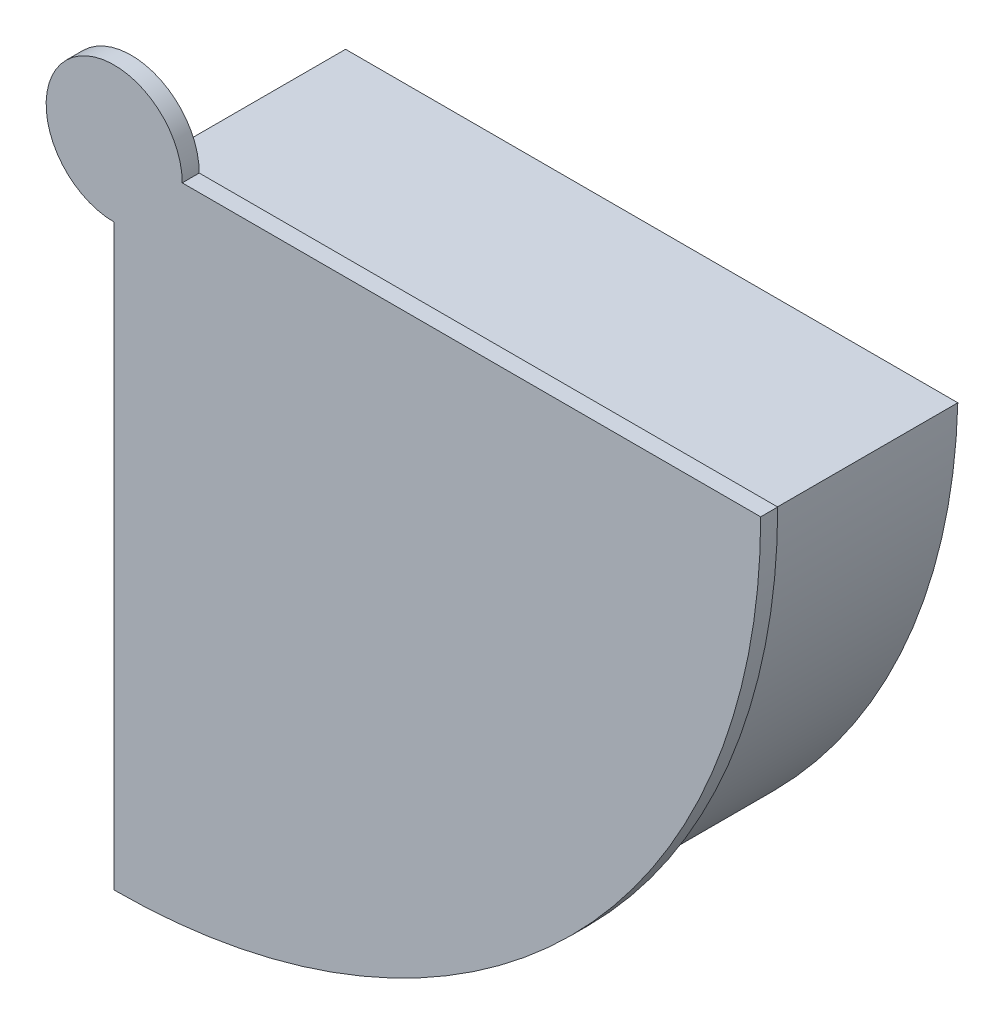
ISO-10303-21;
HEADER;
FILE_DESCRIPTION(('STEP AP214'),'2;1');
FILE_NAME('part.step','',(''),(''),'','','');
FILE_SCHEMA(('AUTOMOTIVE_DESIGN { 1 0 10303 214 1 1 1 1 }'));
ENDSEC;
DATA;
#1=APPLICATION_CONTEXT('core data for automotive mechanical design processes');
#2=APPLICATION_PROTOCOL_DEFINITION('international standard','automotive_design',2000,#1);
#3=PRODUCT_CONTEXT('',#1,'mechanical');
#4=PRODUCT('Part','Part','',(#3));
#5=PRODUCT_RELATED_PRODUCT_CATEGORY('part','',(#4));
#6=PRODUCT_DEFINITION_FORMATION('','',#4);
#7=PRODUCT_DEFINITION_CONTEXT('part definition',#1,'design');
#8=PRODUCT_DEFINITION('design','',#6,#7);
#9=PRODUCT_DEFINITION_SHAPE('','',#8);
#10=(LENGTH_UNIT() NAMED_UNIT(*) SI_UNIT(.MILLI.,.METRE.));
#11=(NAMED_UNIT(*) PLANE_ANGLE_UNIT() SI_UNIT($,.RADIAN.));
#12=(NAMED_UNIT(*) SI_UNIT($,.STERADIAN.) SOLID_ANGLE_UNIT());
#13=UNCERTAINTY_MEASURE_WITH_UNIT(LENGTH_MEASURE(1.E-05),#10,'distance_accuracy_value','');
#14=(GEOMETRIC_REPRESENTATION_CONTEXT(3) GLOBAL_UNCERTAINTY_ASSIGNED_CONTEXT((#13)) GLOBAL_UNIT_ASSIGNED_CONTEXT((#10,
#11,#12)) REPRESENTATION_CONTEXT('',''));
#15=CARTESIAN_POINT('',(0.,0.,0.));
#16=DIRECTION('',(0.,0.,1.));
#17=DIRECTION('',(1.,0.,0.));
#18=AXIS2_PLACEMENT_3D('',#15,#16,#17);
#19=CARTESIAN_POINT('',(0.,0.,0.));
#20=DIRECTION('',(0.,0.,1.));
#21=DIRECTION('',(1.,0.,0.));
#22=AXIS2_PLACEMENT_3D('',#19,#20,#21);
#23=PLANE('',#22);
#24=DIRECTION('',(1.,0.,0.));
#25=VECTOR('',#24,1.);
#26=CARTESIAN_POINT('',(5.,-5.,0.));
#27=LINE('',#26,#25);
#28=CARTESIAN_POINT('',(5.,-5.,0.));
#29=VERTEX_POINT('',#28);
#30=CARTESIAN_POINT('',(184.932420089069,-5.,0.));
#31=VERTEX_POINT('',#30);
#32=EDGE_CURVE('E159',#29,#31,#27,.T.);
#33=ORIENTED_EDGE('',*,*,#32,.F.);
#34=DIRECTION('',(0.,1.,0.));
#35=VECTOR('',#34,1.);
#36=CARTESIAN_POINT('',(5.,-184.932420089069,0.));
#37=LINE('',#36,#35);
#38=CARTESIAN_POINT('',(5.00000000000005,-184.932420089069,0.));
#39=VERTEX_POINT('',#38);
#40=EDGE_CURVE('E58',#39,#29,#37,.T.);
#41=ORIENTED_EDGE('',*,*,#40,.F.);
#42=CARTESIAN_POINT('',(0.,0.,0.));
#43=DIRECTION('',(0.,0.,-1.));
#44=DIRECTION('',(-1.,0.,0.));
#45=AXIS2_PLACEMENT_3D('',#42,#43,#44);
#46=CIRCLE('',#45,185.);
#47=EDGE_CURVE('E155',#31,#39,#46,.T.);
#48=ORIENTED_EDGE('',*,*,#47,.F.);
#49=EDGE_LOOP('',(#33,#41,#48));
#50=FACE_BOUND('',#49,.T.);
#51=DIRECTION('',(0.,-1.,0.));
#52=VECTOR('',#51,1.);
#53=CARTESIAN_POINT('',(0.,0.,0.));
#54=LINE('',#53,#52);
#55=CARTESIAN_POINT('',(0.,-20.,0.));
#56=VERTEX_POINT('',#55);
#57=CARTESIAN_POINT('',(0.,-190.,0.));
#58=VERTEX_POINT('',#57);
#59=EDGE_CURVE('E128',#56,#58,#54,.T.);
#60=ORIENTED_EDGE('',*,*,#59,.F.);
#61=CARTESIAN_POINT('',(0.,0.,0.));
#62=DIRECTION('',(0.,0.,1.));
#63=DIRECTION('',(1.,0.,0.));
#64=AXIS2_PLACEMENT_3D('',#61,#62,#63);
#65=CIRCLE('',#64,20.);
#66=CARTESIAN_POINT('',(20.,0.,0.));
#67=VERTEX_POINT('',#66);
#68=EDGE_CURVE('E115',#67,#56,#65,.T.);
#69=ORIENTED_EDGE('',*,*,#68,.F.);
#70=DIRECTION('',(-1.,0.,0.));
#71=VECTOR('',#70,1.);
#72=CARTESIAN_POINT('',(0.,0.,0.));
#73=LINE('',#72,#71);
#74=CARTESIAN_POINT('',(190.,0.,0.));
#75=VERTEX_POINT('',#74);
#76=EDGE_CURVE('E127',#75,#67,#73,.T.);
#77=ORIENTED_EDGE('',*,*,#76,.F.);
#78=CARTESIAN_POINT('',(0.,0.,0.));
#79=DIRECTION('',(0.,0.,1.));
#80=DIRECTION('',(1.,0.,0.));
#81=AXIS2_PLACEMENT_3D('',#78,#79,#80);
#82=CIRCLE('',#81,190.);
#83=EDGE_CURVE('E134',#58,#75,#82,.T.);
#84=ORIENTED_EDGE('',*,*,#83,.F.);
#85=EDGE_LOOP('',(#60,#69,#77,#84));
#86=FACE_BOUND('',#85,.T.);
#87=ADVANCED_FACE('F35',(#50,#86),#23,.F.);
#88=CARTESIAN_POINT('',(0.,0.,5.));
#89=DIRECTION('',(0.,-1.,0.));
#90=DIRECTION('',(0.,0.,-1.));
#91=AXIS2_PLACEMENT_3D('',#88,#89,#90);
#92=PLANE('',#91);
#93=ORIENTED_EDGE('',*,*,#76,.T.);
#94=DIRECTION('',(0.,0.,1.));
#95=VECTOR('',#94,1.);
#96=CARTESIAN_POINT('',(20.,0.,0.));
#97=LINE('',#96,#95);
#98=CARTESIAN_POINT('',(20.,0.,5.));
#99=VERTEX_POINT('',#98);
#100=EDGE_CURVE('E112',#67,#99,#97,.T.);
#101=ORIENTED_EDGE('',*,*,#100,.T.);
#102=DIRECTION('',(-1.,0.,0.));
#103=VECTOR('',#102,1.);
#104=CARTESIAN_POINT('',(0.,0.,5.));
#105=LINE('',#104,#103);
#106=CARTESIAN_POINT('',(190.,0.,5.));
#107=VERTEX_POINT('',#106);
#108=EDGE_CURVE('E143',#107,#99,#105,.T.);
#109=ORIENTED_EDGE('',*,*,#108,.F.);
#110=DIRECTION('',(0.,0.,-1.));
#111=VECTOR('',#110,1.);
#112=CARTESIAN_POINT('',(190.,0.,5.));
#113=LINE('',#112,#111);
#114=EDGE_CURVE('E43',#107,#75,#113,.T.);
#115=ORIENTED_EDGE('',*,*,#114,.T.);
#116=EDGE_LOOP('',(#93,#101,#109,#115));
#117=FACE_BOUND('',#116,.T.);
#118=ADVANCED_FACE('F37',(#117),#92,.F.);
#119=CARTESIAN_POINT('',(0.,0.,5.));
#120=DIRECTION('',(1.,0.,0.));
#121=DIRECTION('',(0.,0.,-1.));
#122=AXIS2_PLACEMENT_3D('',#119,#120,#121);
#123=PLANE('',#122);
#124=DIRECTION('',(0.,-1.,0.));
#125=VECTOR('',#124,1.);
#126=CARTESIAN_POINT('',(0.,0.,5.));
#127=LINE('',#126,#125);
#128=CARTESIAN_POINT('',(0.,-20.,5.));
#129=VERTEX_POINT('',#128);
#130=CARTESIAN_POINT('',(0.,-190.,5.));
#131=VERTEX_POINT('',#130);
#132=EDGE_CURVE('E144',#129,#131,#127,.T.);
#133=ORIENTED_EDGE('',*,*,#132,.F.);
#134=DIRECTION('',(0.,0.,1.));
#135=VECTOR('',#134,1.);
#136=CARTESIAN_POINT('',(0.,-20.,0.));
#137=LINE('',#136,#135);
#138=EDGE_CURVE('E121',#129,#56,#137,.F.);
#139=ORIENTED_EDGE('',*,*,#138,.T.);
#140=ORIENTED_EDGE('',*,*,#59,.T.);
#141=DIRECTION('',(0.,0.,-1.));
#142=VECTOR('',#141,1.);
#143=CARTESIAN_POINT('',(0.,-190.,5.));
#144=LINE('',#143,#142);
#145=EDGE_CURVE('E11',#131,#58,#144,.T.);
#146=ORIENTED_EDGE('',*,*,#145,.F.);
#147=EDGE_LOOP('',(#133,#139,#140,#146));
#148=FACE_BOUND('',#147,.T.);
#149=ADVANCED_FACE('F190',(#148),#123,.F.);
#150=CARTESIAN_POINT('',(0.,0.,5.));
#151=DIRECTION('',(0.,0.,-1.));
#152=DIRECTION('',(-1.,0.,0.));
#153=AXIS2_PLACEMENT_3D('',#150,#151,#152);
#154=CYLINDRICAL_SURFACE('',#153,190.);
#155=ORIENTED_EDGE('',*,*,#83,.T.);
#156=ORIENTED_EDGE('',*,*,#114,.F.);
#157=CARTESIAN_POINT('',(0.,0.,5.));
#158=DIRECTION('',(0.,0.,1.));
#159=DIRECTION('',(1.,0.,0.));
#160=AXIS2_PLACEMENT_3D('',#157,#158,#159);
#161=CIRCLE('',#160,190.);
#162=EDGE_CURVE('E140',#131,#107,#161,.T.);
#163=ORIENTED_EDGE('',*,*,#162,.F.);
#164=ORIENTED_EDGE('',*,*,#145,.T.);
#165=EDGE_LOOP('',(#155,#156,#163,#164));
#166=FACE_BOUND('',#165,.T.);
#167=ADVANCED_FACE('F192',(#166),#154,.T.);
#168=CARTESIAN_POINT('',(0.,0.,5.));
#169=DIRECTION('',(0.,0.,1.));
#170=DIRECTION('',(1.,0.,0.));
#171=AXIS2_PLACEMENT_3D('',#168,#169,#170);
#172=PLANE('',#171);
#173=ORIENTED_EDGE('',*,*,#108,.T.);
#174=CARTESIAN_POINT('',(0.,0.,5.));
#175=DIRECTION('',(0.,0.,1.));
#176=DIRECTION('',(1.,0.,0.));
#177=AXIS2_PLACEMENT_3D('',#174,#175,#176);
#178=CIRCLE('',#177,20.);
#179=EDGE_CURVE('E50',#99,#129,#178,.T.);
#180=ORIENTED_EDGE('',*,*,#179,.T.);
#181=ORIENTED_EDGE('',*,*,#132,.T.);
#182=ORIENTED_EDGE('',*,*,#162,.T.);
#183=EDGE_LOOP('',(#173,#180,#181,#182));
#184=FACE_BOUND('',#183,.T.);
#185=ADVANCED_FACE('F193',(#184),#172,.T.);
#186=CARTESIAN_POINT('',(0.,0.,-58.));
#187=DIRECTION('',(0.,0.,-1.));
#188=DIRECTION('',(-1.,0.,0.));
#189=AXIS2_PLACEMENT_3D('',#186,#187,#188);
#190=PLANE('',#189);
#191=DIRECTION('',(0.,1.,0.));
#192=VECTOR('',#191,1.);
#193=CARTESIAN_POINT('',(5.,-184.932420089069,-58.));
#194=LINE('',#193,#192);
#195=CARTESIAN_POINT('',(5.00000000000005,-184.932420089069,-58.));
#196=VERTEX_POINT('',#195);
#197=CARTESIAN_POINT('',(5.,-5.,-58.));
#198=VERTEX_POINT('',#197);
#199=EDGE_CURVE('E158',#196,#198,#194,.T.);
#200=ORIENTED_EDGE('',*,*,#199,.T.);
#201=DIRECTION('',(1.,0.,0.));
#202=VECTOR('',#201,1.);
#203=CARTESIAN_POINT('',(5.,-5.,-58.));
#204=LINE('',#203,#202);
#205=CARTESIAN_POINT('',(184.932420089069,-5.,-58.));
#206=VERTEX_POINT('',#205);
#207=EDGE_CURVE('E164',#198,#206,#204,.T.);
#208=ORIENTED_EDGE('',*,*,#207,.T.);
#209=CARTESIAN_POINT('',(0.,0.,-58.));
#210=DIRECTION('',(0.,0.,-1.));
#211=DIRECTION('',(-1.,0.,0.));
#212=AXIS2_PLACEMENT_3D('',#209,#210,#211);
#213=CIRCLE('',#212,185.);
#214=EDGE_CURVE('E154',#206,#196,#213,.T.);
#215=ORIENTED_EDGE('',*,*,#214,.T.);
#216=EDGE_LOOP('',(#200,#208,#215));
#217=FACE_BOUND('',#216,.T.);
#218=CARTESIAN_POINT('',(0.,0.,-58.));
#219=DIRECTION('',(0.,0.,-1.));
#220=DIRECTION('',(-1.,0.,0.));
#221=AXIS2_PLACEMENT_3D('',#218,#219,#220);
#222=CIRCLE('',#221,180.);
#223=CARTESIAN_POINT('',(179.721225288839,-10.0140491649626,-58.));
#224=VERTEX_POINT('',#223);
#225=CARTESIAN_POINT('',(9.75527371497978,-179.735457366502,-58.));
#226=VERTEX_POINT('',#225);
#227=EDGE_CURVE('E184',#224,#226,#222,.T.);
#228=ORIENTED_EDGE('',*,*,#227,.F.);
#229=DIRECTION('',(1.,0.,0.));
#230=VECTOR('',#229,1.);
#231=CARTESIAN_POINT('',(9.75527371497978,-10.0140491649627,-58.));
#232=LINE('',#231,#230);
#233=CARTESIAN_POINT('',(9.75527371497978,-10.0140491649627,-58.));
#234=VERTEX_POINT('',#233);
#235=EDGE_CURVE('E178',#234,#224,#232,.T.);
#236=ORIENTED_EDGE('',*,*,#235,.F.);
#237=DIRECTION('',(0.,1.,0.));
#238=VECTOR('',#237,1.);
#239=CARTESIAN_POINT('',(9.75527371497978,-10.0140491649627,-58.));
#240=LINE('',#239,#238);
#241=EDGE_CURVE('E175',#226,#234,#240,.T.);
#242=ORIENTED_EDGE('',*,*,#241,.F.);
#243=EDGE_LOOP('',(#228,#236,#242));
#244=FACE_BOUND('',#243,.T.);
#245=ADVANCED_FACE('F195',(#217,#244),#190,.T.);
#246=CARTESIAN_POINT('',(5.,-184.932420089069,-58.));
#247=DIRECTION('',(1.,0.,0.));
#248=DIRECTION('',(0.,0.,-1.));
#249=AXIS2_PLACEMENT_3D('',#246,#247,#248);
#250=PLANE('',#249);
#251=ORIENTED_EDGE('',*,*,#40,.T.);
#252=DIRECTION('',(0.,0.,1.));
#253=VECTOR('',#252,1.);
#254=CARTESIAN_POINT('',(5.,-5.,-58.));
#255=LINE('',#254,#253);
#256=EDGE_CURVE('E132',#198,#29,#255,.T.);
#257=ORIENTED_EDGE('',*,*,#256,.F.);
#258=ORIENTED_EDGE('',*,*,#199,.F.);
#259=DIRECTION('',(0.,0.,1.));
#260=VECTOR('',#259,1.);
#261=CARTESIAN_POINT('',(5.00000000000005,-184.932420089069,-58.));
#262=LINE('',#261,#260);
#263=EDGE_CURVE('E152',#196,#39,#262,.T.);
#264=ORIENTED_EDGE('',*,*,#263,.T.);
#265=EDGE_LOOP('',(#251,#257,#258,#264));
#266=FACE_BOUND('',#265,.T.);
#267=ADVANCED_FACE('F201',(#266),#250,.F.);
#268=CARTESIAN_POINT('',(5.,-5.,-58.));
#269=DIRECTION('',(0.,-1.,0.));
#270=DIRECTION('',(0.,0.,-1.));
#271=AXIS2_PLACEMENT_3D('',#268,#269,#270);
#272=PLANE('',#271);
#273=ORIENTED_EDGE('',*,*,#32,.T.);
#274=DIRECTION('',(0.,0.,1.));
#275=VECTOR('',#274,1.);
#276=CARTESIAN_POINT('',(184.932420089069,-5.,-58.));
#277=LINE('',#276,#275);
#278=EDGE_CURVE('E137',#206,#31,#277,.T.);
#279=ORIENTED_EDGE('',*,*,#278,.F.);
#280=ORIENTED_EDGE('',*,*,#207,.F.);
#281=ORIENTED_EDGE('',*,*,#256,.T.);
#282=EDGE_LOOP('',(#273,#279,#280,#281));
#283=FACE_BOUND('',#282,.T.);
#284=ADVANCED_FACE('F246',(#283),#272,.F.);
#285=CARTESIAN_POINT('',(0.,0.,-58.));
#286=DIRECTION('',(0.,0.,1.));
#287=DIRECTION('',(1.,0.,0.));
#288=AXIS2_PLACEMENT_3D('',#285,#286,#287);
#289=CYLINDRICAL_SURFACE('',#288,185.);
#290=ORIENTED_EDGE('',*,*,#47,.T.);
#291=ORIENTED_EDGE('',*,*,#263,.F.);
#292=ORIENTED_EDGE('',*,*,#214,.F.);
#293=ORIENTED_EDGE('',*,*,#278,.T.);
#294=EDGE_LOOP('',(#290,#291,#292,#293));
#295=FACE_BOUND('',#294,.T.);
#296=ADVANCED_FACE('F241',(#295),#289,.T.);
#297=CARTESIAN_POINT('',(9.75527371497978,-10.0140491649627,-58.));
#298=DIRECTION('',(0.,-1.,0.));
#299=DIRECTION('',(1.,0.,0.));
#300=AXIS2_PLACEMENT_3D('',#297,#298,#299);
#301=PLANE('',#300);
#302=DIRECTION('',(1.,0.,0.));
#303=VECTOR('',#302,1.);
#304=CARTESIAN_POINT('',(9.75527371497978,-10.0140491649627,0.));
#305=LINE('',#304,#303);
#306=CARTESIAN_POINT('',(9.75527371497978,-10.0140491649627,0.));
#307=VERTEX_POINT('',#306);
#308=CARTESIAN_POINT('',(179.721225288839,-10.0140491649626,0.));
#309=VERTEX_POINT('',#308);
#310=EDGE_CURVE('E120',#307,#309,#305,.T.);
#311=ORIENTED_EDGE('',*,*,#310,.F.);
#312=DIRECTION('',(0.,0.,1.));
#313=VECTOR('',#312,1.);
#314=CARTESIAN_POINT('',(9.75527371497978,-10.0140491649627,-58.));
#315=LINE('',#314,#313);
#316=EDGE_CURVE('E172',#234,#307,#315,.T.);
#317=ORIENTED_EDGE('',*,*,#316,.F.);
#318=ORIENTED_EDGE('',*,*,#235,.T.);
#319=DIRECTION('',(0.,0.,1.));
#320=VECTOR('',#319,1.);
#321=CARTESIAN_POINT('',(179.721225288839,-10.0140491649626,-58.));
#322=LINE('',#321,#320);
#323=EDGE_CURVE('E162',#224,#309,#322,.T.);
#324=ORIENTED_EDGE('',*,*,#323,.T.);
#325=EDGE_LOOP('',(#311,#317,#318,#324));
#326=FACE_BOUND('',#325,.T.);
#327=ADVANCED_FACE('F231',(#326),#301,.T.);
#328=CARTESIAN_POINT('',(0.,0.,-58.));
#329=DIRECTION('',(0.,0.,1.));
#330=DIRECTION('',(1.,0.,0.));
#331=AXIS2_PLACEMENT_3D('',#328,#329,#330);
#332=CYLINDRICAL_SURFACE('',#331,180.);
#333=CARTESIAN_POINT('',(0.,0.,0.));
#334=DIRECTION('',(0.,0.,-1.));
#335=DIRECTION('',(-1.,0.,0.));
#336=AXIS2_PLACEMENT_3D('',#333,#334,#335);
#337=CIRCLE('',#336,180.);
#338=CARTESIAN_POINT('',(9.75527371497978,-179.735457366502,0.));
#339=VERTEX_POINT('',#338);
#340=EDGE_CURVE('E179',#309,#339,#337,.T.);
#341=ORIENTED_EDGE('',*,*,#340,.F.);
#342=ORIENTED_EDGE('',*,*,#323,.F.);
#343=ORIENTED_EDGE('',*,*,#227,.T.);
#344=DIRECTION('',(0.,0.,1.));
#345=VECTOR('',#344,1.);
#346=CARTESIAN_POINT('',(9.75527371497978,-179.735457366502,-58.));
#347=LINE('',#346,#345);
#348=EDGE_CURVE('E170',#226,#339,#347,.T.);
#349=ORIENTED_EDGE('',*,*,#348,.T.);
#350=EDGE_LOOP('',(#341,#342,#343,#349));
#351=FACE_BOUND('',#350,.T.);
#352=ADVANCED_FACE('F221',(#351),#332,.F.);
#353=CARTESIAN_POINT('',(9.75527371497978,-10.0140491649627,-58.));
#354=DIRECTION('',(1.,0.,0.));
#355=DIRECTION('',(0.,0.,-1.));
#356=AXIS2_PLACEMENT_3D('',#353,#354,#355);
#357=PLANE('',#356);
#358=DIRECTION('',(0.,1.,0.));
#359=VECTOR('',#358,1.);
#360=CARTESIAN_POINT('',(9.75527371497978,-10.0140491649627,0.));
#361=LINE('',#360,#359);
#362=EDGE_CURVE('E176',#339,#307,#361,.T.);
#363=ORIENTED_EDGE('',*,*,#362,.F.);
#364=ORIENTED_EDGE('',*,*,#348,.F.);
#365=ORIENTED_EDGE('',*,*,#241,.T.);
#366=ORIENTED_EDGE('',*,*,#316,.T.);
#367=EDGE_LOOP('',(#363,#364,#365,#366));
#368=FACE_BOUND('',#367,.T.);
#369=ADVANCED_FACE('F214',(#368),#357,.T.);
#370=ORIENTED_EDGE('',*,*,#362,.T.);
#371=ORIENTED_EDGE('',*,*,#310,.T.);
#372=ORIENTED_EDGE('',*,*,#340,.T.);
#373=EDGE_LOOP('',(#370,#371,#372));
#374=FACE_BOUND('',#373,.T.);
#375=ADVANCED_FACE('F209',(#374),#23,.F.);
#376=CARTESIAN_POINT('',(0.,0.,0.));
#377=DIRECTION('',(0.,0.,1.));
#378=DIRECTION('',(1.,0.,0.));
#379=AXIS2_PLACEMENT_3D('',#376,#377,#378);
#380=CYLINDRICAL_SURFACE('',#379,20.);
#381=ORIENTED_EDGE('',*,*,#100,.F.);
#382=ORIENTED_EDGE('',*,*,#68,.T.);
#383=ORIENTED_EDGE('',*,*,#138,.F.);
#384=ORIENTED_EDGE('',*,*,#179,.F.);
#385=EDGE_LOOP('',(#381,#382,#383,#384));
#386=FACE_BOUND('',#385,.T.);
#387=ADVANCED_FACE('F114',(#386),#380,.T.);
#388=CLOSED_SHELL('',(#87,#118,#149,#167,#185,#245,#267,#284,#296,#327,#352,#369,#375,#387));
#389=MANIFOLD_SOLID_BREP('B2',#388);
#390=ADVANCED_BREP_SHAPE_REPRESENTATION('',(#18,#389),#14);
#391=SHAPE_DEFINITION_REPRESENTATION(#9,#390);
ENDSEC;
END-ISO-10303-21;
